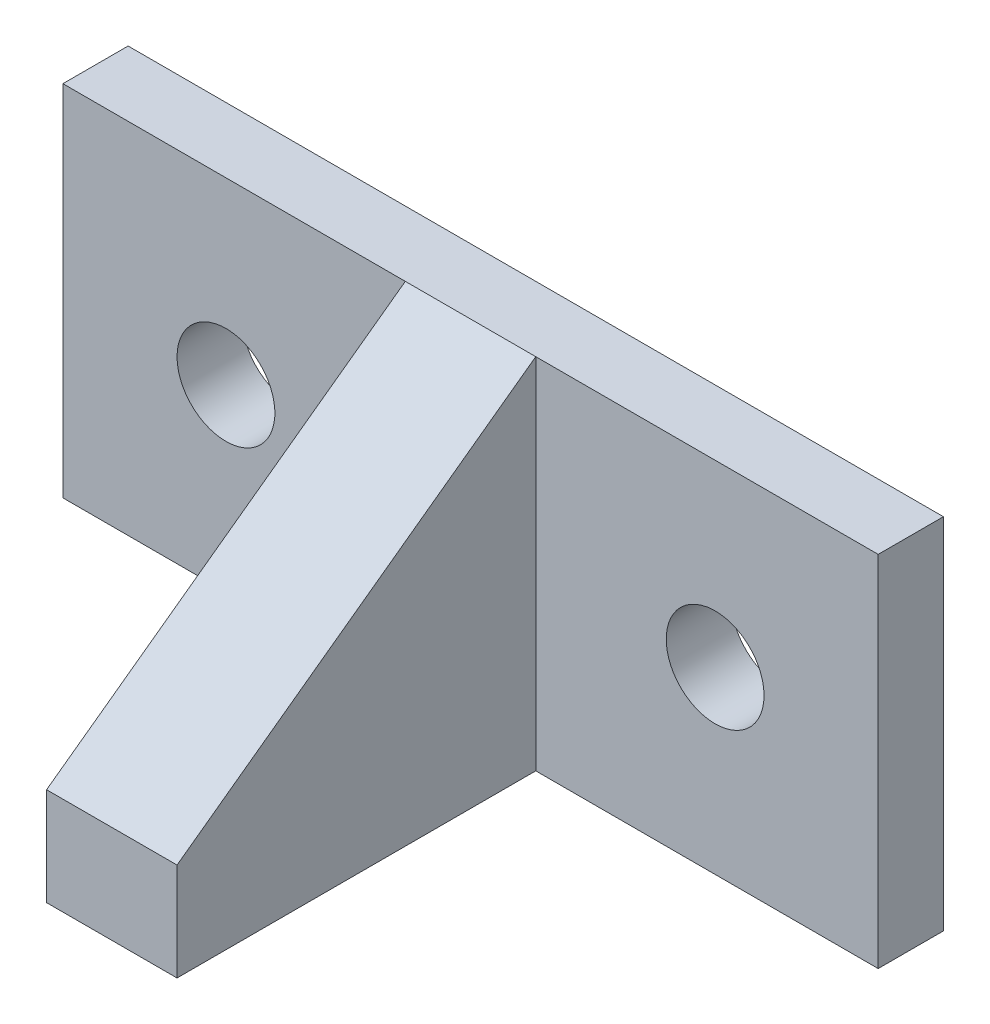
ISO-10303-21;
HEADER;
FILE_DESCRIPTION(('STEP AP214'),'2;1');
FILE_NAME('part.step','',(''),(''),'','','');
FILE_SCHEMA(('AUTOMOTIVE_DESIGN { 1 0 10303 214 1 1 1 1 }'));
ENDSEC;
DATA;
#1=APPLICATION_CONTEXT('core data for automotive mechanical design processes');
#2=APPLICATION_PROTOCOL_DEFINITION('international standard','automotive_design',2000,#1);
#3=PRODUCT_CONTEXT('',#1,'mechanical');
#4=PRODUCT('Part','Part','',(#3));
#5=PRODUCT_RELATED_PRODUCT_CATEGORY('part','',(#4));
#6=PRODUCT_DEFINITION_FORMATION('','',#4);
#7=PRODUCT_DEFINITION_CONTEXT('part definition',#1,'design');
#8=PRODUCT_DEFINITION('design','',#6,#7);
#9=PRODUCT_DEFINITION_SHAPE('','',#8);
#10=(LENGTH_UNIT() NAMED_UNIT(*) SI_UNIT(.MILLI.,.METRE.));
#11=(NAMED_UNIT(*) PLANE_ANGLE_UNIT() SI_UNIT($,.RADIAN.));
#12=(NAMED_UNIT(*) SI_UNIT($,.STERADIAN.) SOLID_ANGLE_UNIT());
#13=UNCERTAINTY_MEASURE_WITH_UNIT(LENGTH_MEASURE(1.E-05),#10,'distance_accuracy_value','');
#14=(GEOMETRIC_REPRESENTATION_CONTEXT(3) GLOBAL_UNCERTAINTY_ASSIGNED_CONTEXT((#13)) GLOBAL_UNIT_ASSIGNED_CONTEXT((#10,
#11,#12)) REPRESENTATION_CONTEXT('',''));
#15=CARTESIAN_POINT('',(0.,0.,0.));
#16=DIRECTION('',(0.,0.,1.));
#17=DIRECTION('',(1.,0.,0.));
#18=AXIS2_PLACEMENT_3D('',#15,#16,#17);
#19=CARTESIAN_POINT('',(0.,0.,10.));
#20=DIRECTION('',(0.,0.,-1.));
#21=DIRECTION('',(-1.,0.,0.));
#22=AXIS2_PLACEMENT_3D('',#19,#20,#21);
#23=PLANE('',#22);
#24=CARTESIAN_POINT('',(37.5,0.,10.));
#25=DIRECTION('',(0.,0.,1.));
#26=DIRECTION('',(1.,0.,0.));
#27=AXIS2_PLACEMENT_3D('',#24,#25,#26);
#28=CIRCLE('',#27,7.5);
#29=CARTESIAN_POINT('',(45.,0.,10.));
#30=VERTEX_POINT('',#29);
#31=EDGE_CURVE('E152',#30,#30,#28,.T.);
#32=ORIENTED_EDGE('',*,*,#31,.F.);
#33=EDGE_LOOP('',(#32));
#34=FACE_BOUND('',#33,.T.);
#35=DIRECTION('',(0.,1.,0.));
#36=VECTOR('',#35,1.);
#37=CARTESIAN_POINT('',(10.,27.5,10.));
#38=LINE('',#37,#36);
#39=CARTESIAN_POINT('',(10.,-27.5,10.));
#40=VERTEX_POINT('',#39);
#41=CARTESIAN_POINT('',(10.,27.5,10.));
#42=VERTEX_POINT('',#41);
#43=EDGE_CURVE('E124',#40,#42,#38,.T.);
#44=ORIENTED_EDGE('',*,*,#43,.F.);
#45=DIRECTION('',(1.,0.,0.));
#46=VECTOR('',#45,1.);
#47=CARTESIAN_POINT('',(-62.5,-27.5,10.));
#48=LINE('',#47,#46);
#49=CARTESIAN_POINT('',(62.5,-27.5,10.));
#50=VERTEX_POINT('',#49);
#51=EDGE_CURVE('E64',#40,#50,#48,.T.);
#52=ORIENTED_EDGE('',*,*,#51,.T.);
#53=DIRECTION('',(0.,1.,0.));
#54=VECTOR('',#53,1.);
#55=CARTESIAN_POINT('',(62.5,-27.5,10.));
#56=LINE('',#55,#54);
#57=CARTESIAN_POINT('',(62.5,27.5,10.));
#58=VERTEX_POINT('',#57);
#59=EDGE_CURVE('E137',#50,#58,#56,.T.);
#60=ORIENTED_EDGE('',*,*,#59,.T.);
#61=DIRECTION('',(-1.,0.,0.));
#62=VECTOR('',#61,1.);
#63=CARTESIAN_POINT('',(-62.5,27.5,10.));
#64=LINE('',#63,#62);
#65=EDGE_CURVE('E95',#58,#42,#64,.T.);
#66=ORIENTED_EDGE('',*,*,#65,.T.);
#67=EDGE_LOOP('',(#44,#52,#60,#66));
#68=FACE_BOUND('',#67,.T.);
#69=ADVANCED_FACE('F39',(#34,#68),#23,.F.);
#70=CARTESIAN_POINT('',(-62.5,-27.5,10.));
#71=VERTEX_POINT('',#70);
#72=CARTESIAN_POINT('',(-10.,-27.5,10.));
#73=VERTEX_POINT('',#72);
#74=EDGE_CURVE('E148',#71,#73,#48,.T.);
#75=ORIENTED_EDGE('',*,*,#74,.T.);
#76=DIRECTION('',(0.,1.,0.));
#77=VECTOR('',#76,1.);
#78=CARTESIAN_POINT('',(-10.,27.5,10.));
#79=LINE('',#78,#77);
#80=CARTESIAN_POINT('',(-10.,27.5,10.));
#81=VERTEX_POINT('',#80);
#82=EDGE_CURVE('E176',#73,#81,#79,.T.);
#83=ORIENTED_EDGE('',*,*,#82,.T.);
#84=CARTESIAN_POINT('',(-62.5,27.5,10.));
#85=VERTEX_POINT('',#84);
#86=EDGE_CURVE('E131',#81,#85,#64,.T.);
#87=ORIENTED_EDGE('',*,*,#86,.T.);
#88=DIRECTION('',(0.,-1.,0.));
#89=VECTOR('',#88,1.);
#90=CARTESIAN_POINT('',(-62.5,-27.5,10.));
#91=LINE('',#90,#89);
#92=EDGE_CURVE('E139',#85,#71,#91,.T.);
#93=ORIENTED_EDGE('',*,*,#92,.T.);
#94=EDGE_LOOP('',(#75,#83,#87,#93));
#95=FACE_BOUND('',#94,.T.);
#96=CARTESIAN_POINT('',(-37.5,0.,10.));
#97=DIRECTION('',(0.,0.,1.));
#98=DIRECTION('',(-1.,0.,0.));
#99=AXIS2_PLACEMENT_3D('',#96,#97,#98);
#100=CIRCLE('',#99,7.5);
#101=CARTESIAN_POINT('',(-45.,0.,10.));
#102=VERTEX_POINT('',#101);
#103=EDGE_CURVE('E189',#102,#102,#100,.T.);
#104=ORIENTED_EDGE('',*,*,#103,.F.);
#105=EDGE_LOOP('',(#104));
#106=FACE_BOUND('',#105,.T.);
#107=ADVANCED_FACE('F214',(#95,#106),#23,.F.);
#108=CARTESIAN_POINT('',(0.,0.,0.));
#109=DIRECTION('',(0.,0.,-1.));
#110=DIRECTION('',(-1.,0.,0.));
#111=AXIS2_PLACEMENT_3D('',#108,#109,#110);
#112=PLANE('',#111);
#113=CARTESIAN_POINT('',(37.5,0.,0.));
#114=DIRECTION('',(0.,0.,1.));
#115=DIRECTION('',(1.,0.,0.));
#116=AXIS2_PLACEMENT_3D('',#113,#114,#115);
#117=CIRCLE('',#116,7.5);
#118=CARTESIAN_POINT('',(45.,0.,0.));
#119=VERTEX_POINT('',#118);
#120=EDGE_CURVE('E191',#119,#119,#117,.T.);
#121=ORIENTED_EDGE('',*,*,#120,.T.);
#122=EDGE_LOOP('',(#121));
#123=FACE_BOUND('',#122,.T.);
#124=DIRECTION('',(0.,1.,0.));
#125=VECTOR('',#124,1.);
#126=CARTESIAN_POINT('',(62.5,-27.5,0.));
#127=LINE('',#126,#125);
#128=CARTESIAN_POINT('',(62.5,-27.5,0.));
#129=VERTEX_POINT('',#128);
#130=CARTESIAN_POINT('',(62.5,27.5,0.));
#131=VERTEX_POINT('',#130);
#132=EDGE_CURVE('E147',#129,#131,#127,.T.);
#133=ORIENTED_EDGE('',*,*,#132,.F.);
#134=DIRECTION('',(1.,0.,0.));
#135=VECTOR('',#134,1.);
#136=CARTESIAN_POINT('',(-62.5,-27.5,0.));
#137=LINE('',#136,#135);
#138=CARTESIAN_POINT('',(-62.5,-27.5,0.));
#139=VERTEX_POINT('',#138);
#140=EDGE_CURVE('E84',#139,#129,#137,.T.);
#141=ORIENTED_EDGE('',*,*,#140,.F.);
#142=DIRECTION('',(0.,-1.,0.));
#143=VECTOR('',#142,1.);
#144=CARTESIAN_POINT('',(-62.5,-27.5,0.));
#145=LINE('',#144,#143);
#146=CARTESIAN_POINT('',(-62.5,27.5,0.));
#147=VERTEX_POINT('',#146);
#148=EDGE_CURVE('E156',#147,#139,#145,.T.);
#149=ORIENTED_EDGE('',*,*,#148,.F.);
#150=DIRECTION('',(-1.,0.,0.));
#151=VECTOR('',#150,1.);
#152=CARTESIAN_POINT('',(-62.5,27.5,0.));
#153=LINE('',#152,#151);
#154=EDGE_CURVE('E153',#131,#147,#153,.T.);
#155=ORIENTED_EDGE('',*,*,#154,.F.);
#156=EDGE_LOOP('',(#133,#141,#149,#155));
#157=FACE_BOUND('',#156,.T.);
#158=CARTESIAN_POINT('',(-37.5,0.,0.));
#159=DIRECTION('',(0.,0.,1.));
#160=DIRECTION('',(-1.,0.,0.));
#161=AXIS2_PLACEMENT_3D('',#158,#159,#160);
#162=CIRCLE('',#161,7.5);
#163=CARTESIAN_POINT('',(-45.,0.,0.));
#164=VERTEX_POINT('',#163);
#165=EDGE_CURVE('E187',#164,#164,#162,.T.);
#166=ORIENTED_EDGE('',*,*,#165,.T.);
#167=EDGE_LOOP('',(#166));
#168=FACE_BOUND('',#167,.T.);
#169=ADVANCED_FACE('F166',(#123,#157,#168),#112,.T.);
#170=CARTESIAN_POINT('',(62.5,-27.5,10.));
#171=DIRECTION('',(-1.,0.,0.));
#172=DIRECTION('',(0.,0.,1.));
#173=AXIS2_PLACEMENT_3D('',#170,#171,#172);
#174=PLANE('',#173);
#175=ORIENTED_EDGE('',*,*,#132,.T.);
#176=DIRECTION('',(0.,0.,-1.));
#177=VECTOR('',#176,1.);
#178=CARTESIAN_POINT('',(62.5,27.5,10.));
#179=LINE('',#178,#177);
#180=EDGE_CURVE('E11',#58,#131,#179,.T.);
#181=ORIENTED_EDGE('',*,*,#180,.F.);
#182=ORIENTED_EDGE('',*,*,#59,.F.);
#183=DIRECTION('',(0.,0.,-1.));
#184=VECTOR('',#183,1.);
#185=CARTESIAN_POINT('',(62.5,-27.5,10.));
#186=LINE('',#185,#184);
#187=EDGE_CURVE('E149',#50,#129,#186,.T.);
#188=ORIENTED_EDGE('',*,*,#187,.T.);
#189=EDGE_LOOP('',(#175,#181,#182,#188));
#190=FACE_BOUND('',#189,.T.);
#191=ADVANCED_FACE('F41',(#190),#174,.F.);
#192=CARTESIAN_POINT('',(-62.5,27.5,10.));
#193=DIRECTION('',(0.,-1.,0.));
#194=DIRECTION('',(0.,0.,-1.));
#195=AXIS2_PLACEMENT_3D('',#192,#193,#194);
#196=PLANE('',#195);
#197=ORIENTED_EDGE('',*,*,#154,.T.);
#198=DIRECTION('',(0.,0.,-1.));
#199=VECTOR('',#198,1.);
#200=CARTESIAN_POINT('',(-62.5,27.5,10.));
#201=LINE('',#200,#199);
#202=EDGE_CURVE('E50',#85,#147,#201,.T.);
#203=ORIENTED_EDGE('',*,*,#202,.F.);
#204=ORIENTED_EDGE('',*,*,#86,.F.);
#205=DIRECTION('',(1.,0.,0.));
#206=VECTOR('',#205,1.);
#207=CARTESIAN_POINT('',(-10.,27.5,10.));
#208=LINE('',#207,#206);
#209=EDGE_CURVE('E119',#81,#42,#208,.T.);
#210=ORIENTED_EDGE('',*,*,#209,.T.);
#211=ORIENTED_EDGE('',*,*,#65,.F.);
#212=ORIENTED_EDGE('',*,*,#180,.T.);
#213=EDGE_LOOP('',(#197,#203,#204,#210,#211,#212));
#214=FACE_BOUND('',#213,.T.);
#215=ADVANCED_FACE('F135',(#214),#196,.F.);
#216=CARTESIAN_POINT('',(-62.5,-27.5,10.));
#217=DIRECTION('',(1.,0.,0.));
#218=DIRECTION('',(0.,0.,-1.));
#219=AXIS2_PLACEMENT_3D('',#216,#217,#218);
#220=PLANE('',#219);
#221=ORIENTED_EDGE('',*,*,#148,.T.);
#222=DIRECTION('',(0.,0.,-1.));
#223=VECTOR('',#222,1.);
#224=CARTESIAN_POINT('',(-62.5,-27.5,10.));
#225=LINE('',#224,#223);
#226=EDGE_CURVE('E159',#71,#139,#225,.T.);
#227=ORIENTED_EDGE('',*,*,#226,.F.);
#228=ORIENTED_EDGE('',*,*,#92,.F.);
#229=ORIENTED_EDGE('',*,*,#202,.T.);
#230=EDGE_LOOP('',(#221,#227,#228,#229));
#231=FACE_BOUND('',#230,.T.);
#232=ADVANCED_FACE('F164',(#231),#220,.F.);
#233=CARTESIAN_POINT('',(-62.5,-27.5,10.));
#234=DIRECTION('',(0.,1.,0.));
#235=DIRECTION('',(0.,0.,1.));
#236=AXIS2_PLACEMENT_3D('',#233,#234,#235);
#237=PLANE('',#236);
#238=ORIENTED_EDGE('',*,*,#140,.T.);
#239=ORIENTED_EDGE('',*,*,#187,.F.);
#240=ORIENTED_EDGE('',*,*,#51,.F.);
#241=DIRECTION('',(0.,0.,-1.));
#242=VECTOR('',#241,1.);
#243=CARTESIAN_POINT('',(10.,-27.5,10.));
#244=LINE('',#243,#242);
#245=CARTESIAN_POINT('',(10.,-27.5,65.));
#246=VERTEX_POINT('',#245);
#247=EDGE_CURVE('E129',#246,#40,#244,.T.);
#248=ORIENTED_EDGE('',*,*,#247,.F.);
#249=DIRECTION('',(1.,0.,0.));
#250=VECTOR('',#249,1.);
#251=CARTESIAN_POINT('',(-10.,-27.5,65.));
#252=LINE('',#251,#250);
#253=CARTESIAN_POINT('',(-10.,-27.5,65.));
#254=VERTEX_POINT('',#253);
#255=EDGE_CURVE('E171',#254,#246,#252,.T.);
#256=ORIENTED_EDGE('',*,*,#255,.F.);
#257=DIRECTION('',(0.,0.,-1.));
#258=VECTOR('',#257,1.);
#259=CARTESIAN_POINT('',(-10.,-27.5,10.));
#260=LINE('',#259,#258);
#261=EDGE_CURVE('E133',#254,#73,#260,.T.);
#262=ORIENTED_EDGE('',*,*,#261,.T.);
#263=ORIENTED_EDGE('',*,*,#74,.F.);
#264=ORIENTED_EDGE('',*,*,#226,.T.);
#265=EDGE_LOOP('',(#238,#239,#240,#248,#256,#262,#263,#264));
#266=FACE_BOUND('',#265,.T.);
#267=ADVANCED_FACE('F175',(#266),#237,.F.);
#268=CARTESIAN_POINT('',(37.5,0.,10.));
#269=DIRECTION('',(0.,0.,-1.));
#270=DIRECTION('',(-1.,0.,0.));
#271=AXIS2_PLACEMENT_3D('',#268,#269,#270);
#272=CYLINDRICAL_SURFACE('',#271,7.5);
#273=ORIENTED_EDGE('',*,*,#31,.T.);
#274=EDGE_LOOP('',(#273));
#275=FACE_BOUND('',#274,.T.);
#276=ORIENTED_EDGE('',*,*,#120,.F.);
#277=EDGE_LOOP('',(#276));
#278=FACE_BOUND('',#277,.T.);
#279=ADVANCED_FACE('F200',(#275,#278),#272,.F.);
#280=CARTESIAN_POINT('',(-37.5,0.,10.));
#281=DIRECTION('',(0.,0.,-1.));
#282=DIRECTION('',(-1.,0.,0.));
#283=AXIS2_PLACEMENT_3D('',#280,#281,#282);
#284=CYLINDRICAL_SURFACE('',#283,7.5);
#285=ORIENTED_EDGE('',*,*,#103,.T.);
#286=EDGE_LOOP('',(#285));
#287=FACE_BOUND('',#286,.T.);
#288=ORIENTED_EDGE('',*,*,#165,.F.);
#289=EDGE_LOOP('',(#288));
#290=FACE_BOUND('',#289,.T.);
#291=ADVANCED_FACE('F203',(#287,#290),#284,.F.);
#292=CARTESIAN_POINT('',(-10.,-27.5,65.));
#293=DIRECTION('',(0.,0.,1.));
#294=DIRECTION('',(1.,0.,0.));
#295=AXIS2_PLACEMENT_3D('',#292,#293,#294);
#296=PLANE('',#295);
#297=ORIENTED_EDGE('',*,*,#255,.T.);
#298=DIRECTION('',(0.,-1.,0.));
#299=VECTOR('',#298,1.);
#300=CARTESIAN_POINT('',(10.,-27.5,65.));
#301=LINE('',#300,#299);
#302=CARTESIAN_POINT('',(10.,-12.5,65.));
#303=VERTEX_POINT('',#302);
#304=EDGE_CURVE('E123',#303,#246,#301,.T.);
#305=ORIENTED_EDGE('',*,*,#304,.F.);
#306=DIRECTION('',(1.,0.,0.));
#307=VECTOR('',#306,1.);
#308=CARTESIAN_POINT('',(-10.,-12.5,65.));
#309=LINE('',#308,#307);
#310=CARTESIAN_POINT('',(-10.,-12.5,65.));
#311=VERTEX_POINT('',#310);
#312=EDGE_CURVE('E118',#311,#303,#309,.T.);
#313=ORIENTED_EDGE('',*,*,#312,.F.);
#314=DIRECTION('',(0.,-1.,0.));
#315=VECTOR('',#314,1.);
#316=CARTESIAN_POINT('',(-10.,-27.5,65.));
#317=LINE('',#316,#315);
#318=EDGE_CURVE('E185',#311,#254,#317,.T.);
#319=ORIENTED_EDGE('',*,*,#318,.T.);
#320=EDGE_LOOP('',(#297,#305,#313,#319));
#321=FACE_BOUND('',#320,.T.);
#322=ADVANCED_FACE('F208',(#321),#296,.T.);
#323=CARTESIAN_POINT('',(-10.,-12.5,65.));
#324=DIRECTION('',(0.,0.808736084303188,0.588171697675046));
#325=DIRECTION('',(0.,-0.588171697675046,0.808736084303188));
#326=AXIS2_PLACEMENT_3D('',#323,#324,#325);
#327=PLANE('',#326);
#328=ORIENTED_EDGE('',*,*,#312,.T.);
#329=DIRECTION('',(0.,-0.588171697675046,0.808736084303188));
#330=VECTOR('',#329,1.);
#331=CARTESIAN_POINT('',(10.,-12.5,65.));
#332=LINE('',#331,#330);
#333=EDGE_CURVE('E113',#42,#303,#332,.T.);
#334=ORIENTED_EDGE('',*,*,#333,.F.);
#335=ORIENTED_EDGE('',*,*,#209,.F.);
#336=DIRECTION('',(0.,-0.588171697675046,0.808736084303188));
#337=VECTOR('',#336,1.);
#338=CARTESIAN_POINT('',(-10.,-12.5,65.));
#339=LINE('',#338,#337);
#340=EDGE_CURVE('E53',#81,#311,#339,.T.);
#341=ORIENTED_EDGE('',*,*,#340,.T.);
#342=EDGE_LOOP('',(#328,#334,#335,#341));
#343=FACE_BOUND('',#342,.T.);
#344=ADVANCED_FACE('F120',(#343),#327,.T.);
#345=CARTESIAN_POINT('',(-10.,0.,0.));
#346=DIRECTION('',(-1.,0.,0.));
#347=DIRECTION('',(0.,0.,1.));
#348=AXIS2_PLACEMENT_3D('',#345,#346,#347);
#349=PLANE('',#348);
#350=ORIENTED_EDGE('',*,*,#82,.F.);
#351=ORIENTED_EDGE('',*,*,#261,.F.);
#352=ORIENTED_EDGE('',*,*,#318,.F.);
#353=ORIENTED_EDGE('',*,*,#340,.F.);
#354=EDGE_LOOP('',(#350,#351,#352,#353));
#355=FACE_BOUND('',#354,.T.);
#356=ADVANCED_FACE('F278',(#355),#349,.T.);
#357=CARTESIAN_POINT('',(10.,0.,0.));
#358=DIRECTION('',(-1.,0.,0.));
#359=DIRECTION('',(0.,0.,1.));
#360=AXIS2_PLACEMENT_3D('',#357,#358,#359);
#361=PLANE('',#360);
#362=ORIENTED_EDGE('',*,*,#43,.T.);
#363=ORIENTED_EDGE('',*,*,#333,.T.);
#364=ORIENTED_EDGE('',*,*,#304,.T.);
#365=ORIENTED_EDGE('',*,*,#247,.T.);
#366=EDGE_LOOP('',(#362,#363,#364,#365));
#367=FACE_BOUND('',#366,.T.);
#368=ADVANCED_FACE('F130',(#367),#361,.F.);
#369=CLOSED_SHELL('',(#69,#107,#169,#191,#215,#232,#267,#279,#291,#322,#344,#356,#368));
#370=MANIFOLD_SOLID_BREP('B2',#369);
#371=ADVANCED_BREP_SHAPE_REPRESENTATION('',(#18,#370),#14);
#372=SHAPE_DEFINITION_REPRESENTATION(#9,#371);
ENDSEC;
END-ISO-10303-21;
